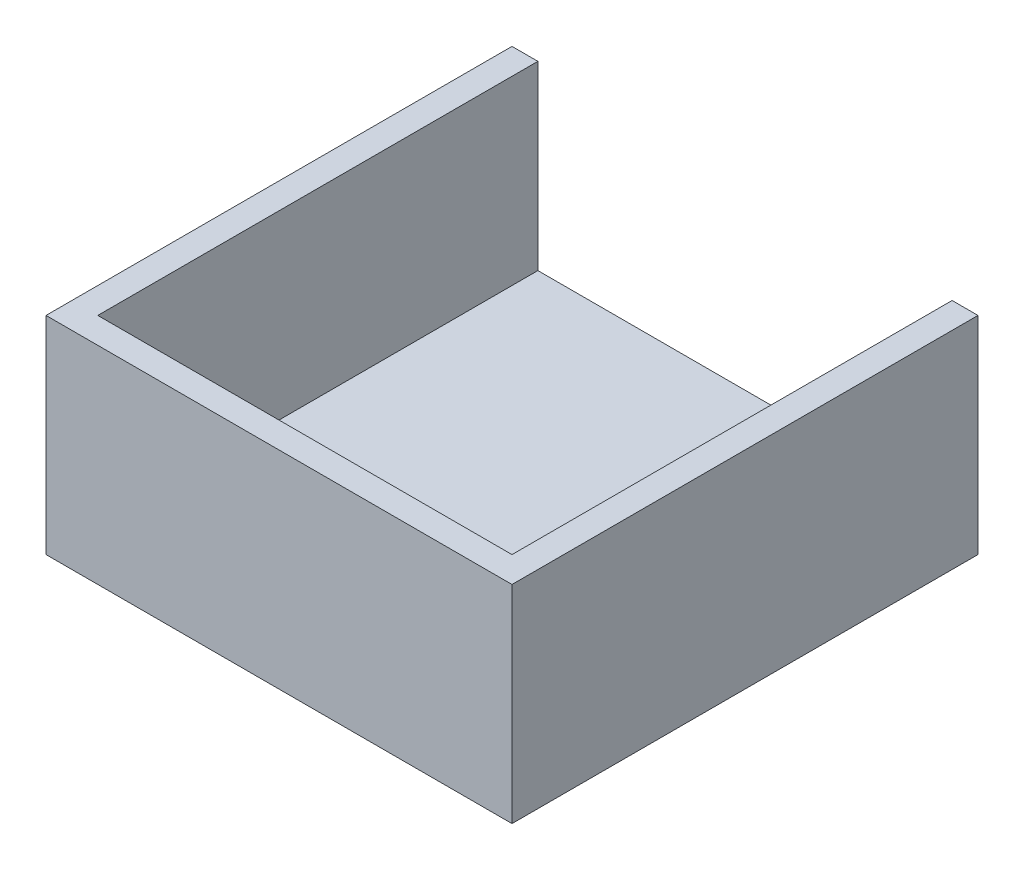
ISO-10303-21;
HEADER;
FILE_DESCRIPTION(('STEP AP214'),'2;1');
FILE_NAME('part.step','',(''),(''),'','','');
FILE_SCHEMA(('AUTOMOTIVE_DESIGN { 1 0 10303 214 1 1 1 1 }'));
ENDSEC;
DATA;
#1=APPLICATION_CONTEXT('core data for automotive mechanical design processes');
#2=APPLICATION_PROTOCOL_DEFINITION('international standard','automotive_design',2000,#1);
#3=PRODUCT_CONTEXT('',#1,'mechanical');
#4=PRODUCT('Part','Part','',(#3));
#5=PRODUCT_RELATED_PRODUCT_CATEGORY('part','',(#4));
#6=PRODUCT_DEFINITION_FORMATION('','',#4);
#7=PRODUCT_DEFINITION_CONTEXT('part definition',#1,'design');
#8=PRODUCT_DEFINITION('design','',#6,#7);
#9=PRODUCT_DEFINITION_SHAPE('','',#8);
#10=(LENGTH_UNIT() NAMED_UNIT(*) SI_UNIT(.MILLI.,.METRE.));
#11=(NAMED_UNIT(*) PLANE_ANGLE_UNIT() SI_UNIT($,.RADIAN.));
#12=(NAMED_UNIT(*) SI_UNIT($,.STERADIAN.) SOLID_ANGLE_UNIT());
#13=UNCERTAINTY_MEASURE_WITH_UNIT(LENGTH_MEASURE(1.E-05),#10,'distance_accuracy_value','');
#14=(GEOMETRIC_REPRESENTATION_CONTEXT(3) GLOBAL_UNCERTAINTY_ASSIGNED_CONTEXT((#13)) GLOBAL_UNIT_ASSIGNED_CONTEXT((#10,
#11,#12)) REPRESENTATION_CONTEXT('',''));
#15=CARTESIAN_POINT('',(0.,0.,0.));
#16=DIRECTION('',(0.,0.,1.));
#17=DIRECTION('',(1.,0.,0.));
#18=AXIS2_PLACEMENT_3D('',#15,#16,#17);
#19=CARTESIAN_POINT('',(9.,8.,-9.));
#20=DIRECTION('',(0.,0.,1.));
#21=DIRECTION('',(1.,0.,0.));
#22=AXIS2_PLACEMENT_3D('',#19,#20,#21);
#23=PLANE('',#22);
#24=DIRECTION('',(0.,1.,0.));
#25=VECTOR('',#24,1.);
#26=CARTESIAN_POINT('',(8.,1.,-9.));
#27=LINE('',#26,#25);
#28=CARTESIAN_POINT('',(8.,1.,-9.));
#29=VERTEX_POINT('',#28);
#30=CARTESIAN_POINT('',(8.,8.,-9.));
#31=VERTEX_POINT('',#30);
#32=EDGE_CURVE('E125',#29,#31,#27,.T.);
#33=ORIENTED_EDGE('',*,*,#32,.T.);
#34=DIRECTION('',(-1.,0.,0.));
#35=VECTOR('',#34,1.);
#36=CARTESIAN_POINT('',(9.,8.,-9.));
#37=LINE('',#36,#35);
#38=CARTESIAN_POINT('',(9.,8.,-9.));
#39=VERTEX_POINT('',#38);
#40=EDGE_CURVE('E145',#39,#31,#37,.T.);
#41=ORIENTED_EDGE('',*,*,#40,.F.);
#42=DIRECTION('',(0.,-1.,0.));
#43=VECTOR('',#42,1.);
#44=CARTESIAN_POINT('',(9.,8.,-9.));
#45=LINE('',#44,#43);
#46=CARTESIAN_POINT('',(9.,0.,-9.));
#47=VERTEX_POINT('',#46);
#48=EDGE_CURVE('E154',#39,#47,#45,.T.);
#49=ORIENTED_EDGE('',*,*,#48,.T.);
#50=DIRECTION('',(-1.,0.,0.));
#51=VECTOR('',#50,1.);
#52=CARTESIAN_POINT('',(9.,0.,-9.));
#53=LINE('',#52,#51);
#54=CARTESIAN_POINT('',(-9.,0.,-9.));
#55=VERTEX_POINT('',#54);
#56=EDGE_CURVE('E78',#47,#55,#53,.T.);
#57=ORIENTED_EDGE('',*,*,#56,.T.);
#58=DIRECTION('',(0.,-1.,0.));
#59=VECTOR('',#58,1.);
#60=CARTESIAN_POINT('',(-9.,8.,-9.));
#61=LINE('',#60,#59);
#62=CARTESIAN_POINT('',(-9.,8.,-9.));
#63=VERTEX_POINT('',#62);
#64=EDGE_CURVE('E147',#63,#55,#61,.T.);
#65=ORIENTED_EDGE('',*,*,#64,.F.);
#66=CARTESIAN_POINT('',(-8.,8.,-9.));
#67=VERTEX_POINT('',#66);
#68=EDGE_CURVE('E56',#67,#63,#37,.T.);
#69=ORIENTED_EDGE('',*,*,#68,.F.);
#70=DIRECTION('',(0.,1.,0.));
#71=VECTOR('',#70,1.);
#72=CARTESIAN_POINT('',(-8.,1.,-9.));
#73=LINE('',#72,#71);
#74=CARTESIAN_POINT('',(-8.,1.,-9.));
#75=VERTEX_POINT('',#74);
#76=EDGE_CURVE('E48',#75,#67,#73,.T.);
#77=ORIENTED_EDGE('',*,*,#76,.F.);
#78=DIRECTION('',(1.,0.,0.));
#79=VECTOR('',#78,1.);
#80=CARTESIAN_POINT('',(0.,1.,-9.));
#81=LINE('',#80,#79);
#82=EDGE_CURVE('E167',#75,#29,#81,.T.);
#83=ORIENTED_EDGE('',*,*,#82,.T.);
#84=EDGE_LOOP('',(#33,#41,#49,#57,#65,#69,#77,#83));
#85=FACE_BOUND('',#84,.T.);
#86=ADVANCED_FACE('F33',(#85),#23,.F.);
#87=CARTESIAN_POINT('',(0.,8.,0.));
#88=DIRECTION('',(0.,1.,0.));
#89=DIRECTION('',(0.,0.,1.));
#90=AXIS2_PLACEMENT_3D('',#87,#88,#89);
#91=PLANE('',#90);
#92=ORIENTED_EDGE('',*,*,#40,.T.);
#93=DIRECTION('',(0.,0.,1.));
#94=VECTOR('',#93,1.);
#95=CARTESIAN_POINT('',(8.,8.,0.));
#96=LINE('',#95,#94);
#97=CARTESIAN_POINT('',(8.,8.,8.));
#98=VERTEX_POINT('',#97);
#99=EDGE_CURVE('E172',#31,#98,#96,.T.);
#100=ORIENTED_EDGE('',*,*,#99,.T.);
#101=DIRECTION('',(-1.,0.,0.));
#102=VECTOR('',#101,1.);
#103=CARTESIAN_POINT('',(0.,8.,8.));
#104=LINE('',#103,#102);
#105=CARTESIAN_POINT('',(-8.,8.,8.));
#106=VERTEX_POINT('',#105);
#107=EDGE_CURVE('E130',#98,#106,#104,.T.);
#108=ORIENTED_EDGE('',*,*,#107,.T.);
#109=DIRECTION('',(0.,0.,-1.));
#110=VECTOR('',#109,1.);
#111=CARTESIAN_POINT('',(-8.,8.,0.));
#112=LINE('',#111,#110);
#113=EDGE_CURVE('E126',#106,#67,#112,.T.);
#114=ORIENTED_EDGE('',*,*,#113,.T.);
#115=ORIENTED_EDGE('',*,*,#68,.T.);
#116=DIRECTION('',(0.,0.,1.));
#117=VECTOR('',#116,1.);
#118=CARTESIAN_POINT('',(-9.,8.,9.));
#119=LINE('',#118,#117);
#120=CARTESIAN_POINT('',(-9.,8.,9.));
#121=VERTEX_POINT('',#120);
#122=EDGE_CURVE('E140',#63,#121,#119,.T.);
#123=ORIENTED_EDGE('',*,*,#122,.T.);
#124=DIRECTION('',(1.,0.,0.));
#125=VECTOR('',#124,1.);
#126=CARTESIAN_POINT('',(9.,8.,9.));
#127=LINE('',#126,#125);
#128=CARTESIAN_POINT('',(9.,8.,9.));
#129=VERTEX_POINT('',#128);
#130=EDGE_CURVE('E85',#121,#129,#127,.T.);
#131=ORIENTED_EDGE('',*,*,#130,.T.);
#132=DIRECTION('',(0.,0.,-1.));
#133=VECTOR('',#132,1.);
#134=CARTESIAN_POINT('',(9.,8.,9.));
#135=LINE('',#134,#133);
#136=EDGE_CURVE('E143',#129,#39,#135,.T.);
#137=ORIENTED_EDGE('',*,*,#136,.T.);
#138=EDGE_LOOP('',(#92,#100,#108,#114,#115,#123,#131,#137));
#139=FACE_BOUND('',#138,.T.);
#140=ADVANCED_FACE('F176',(#139),#91,.T.);
#141=CARTESIAN_POINT('',(-9.,8.,9.));
#142=DIRECTION('',(1.,0.,0.));
#143=DIRECTION('',(0.,0.,-1.));
#144=AXIS2_PLACEMENT_3D('',#141,#142,#143);
#145=PLANE('',#144);
#146=DIRECTION('',(0.,0.,1.));
#147=VECTOR('',#146,1.);
#148=CARTESIAN_POINT('',(-9.,0.,9.));
#149=LINE('',#148,#147);
#150=CARTESIAN_POINT('',(-9.,0.,9.));
#151=VERTEX_POINT('',#150);
#152=EDGE_CURVE('E131',#55,#151,#149,.T.);
#153=ORIENTED_EDGE('',*,*,#152,.T.);
#154=DIRECTION('',(0.,-1.,0.));
#155=VECTOR('',#154,1.);
#156=CARTESIAN_POINT('',(-9.,8.,9.));
#157=LINE('',#156,#155);
#158=EDGE_CURVE('E11',#121,#151,#157,.T.);
#159=ORIENTED_EDGE('',*,*,#158,.F.);
#160=ORIENTED_EDGE('',*,*,#122,.F.);
#161=ORIENTED_EDGE('',*,*,#64,.T.);
#162=EDGE_LOOP('',(#153,#159,#160,#161));
#163=FACE_BOUND('',#162,.T.);
#164=ADVANCED_FACE('F35',(#163),#145,.F.);
#165=CARTESIAN_POINT('',(9.,8.,9.));
#166=DIRECTION('',(0.,0.,-1.));
#167=DIRECTION('',(-1.,0.,0.));
#168=AXIS2_PLACEMENT_3D('',#165,#166,#167);
#169=PLANE('',#168);
#170=DIRECTION('',(1.,0.,0.));
#171=VECTOR('',#170,1.);
#172=CARTESIAN_POINT('',(9.,0.,9.));
#173=LINE('',#172,#171);
#174=CARTESIAN_POINT('',(9.,0.,9.));
#175=VERTEX_POINT('',#174);
#176=EDGE_CURVE('E135',#151,#175,#173,.T.);
#177=ORIENTED_EDGE('',*,*,#176,.T.);
#178=DIRECTION('',(0.,-1.,0.));
#179=VECTOR('',#178,1.);
#180=CARTESIAN_POINT('',(9.,8.,9.));
#181=LINE('',#180,#179);
#182=EDGE_CURVE('E41',#129,#175,#181,.T.);
#183=ORIENTED_EDGE('',*,*,#182,.F.);
#184=ORIENTED_EDGE('',*,*,#130,.F.);
#185=ORIENTED_EDGE('',*,*,#158,.T.);
#186=EDGE_LOOP('',(#177,#183,#184,#185));
#187=FACE_BOUND('',#186,.T.);
#188=ADVANCED_FACE('F184',(#187),#169,.F.);
#189=CARTESIAN_POINT('',(9.,8.,9.));
#190=DIRECTION('',(-1.,0.,0.));
#191=DIRECTION('',(0.,0.,1.));
#192=AXIS2_PLACEMENT_3D('',#189,#190,#191);
#193=PLANE('',#192);
#194=DIRECTION('',(0.,0.,-1.));
#195=VECTOR('',#194,1.);
#196=CARTESIAN_POINT('',(9.,0.,9.));
#197=LINE('',#196,#195);
#198=EDGE_CURVE('E150',#175,#47,#197,.T.);
#199=ORIENTED_EDGE('',*,*,#198,.T.);
#200=ORIENTED_EDGE('',*,*,#48,.F.);
#201=ORIENTED_EDGE('',*,*,#136,.F.);
#202=ORIENTED_EDGE('',*,*,#182,.T.);
#203=EDGE_LOOP('',(#199,#200,#201,#202));
#204=FACE_BOUND('',#203,.T.);
#205=ADVANCED_FACE('F159',(#204),#193,.F.);
#206=CARTESIAN_POINT('',(0.,0.,0.));
#207=DIRECTION('',(0.,1.,0.));
#208=DIRECTION('',(0.,0.,1.));
#209=AXIS2_PLACEMENT_3D('',#206,#207,#208);
#210=PLANE('',#209);
#211=ORIENTED_EDGE('',*,*,#152,.F.);
#212=ORIENTED_EDGE('',*,*,#56,.F.);
#213=ORIENTED_EDGE('',*,*,#198,.F.);
#214=ORIENTED_EDGE('',*,*,#176,.F.);
#215=EDGE_LOOP('',(#211,#212,#213,#214));
#216=FACE_BOUND('',#215,.T.);
#217=ADVANCED_FACE('F163',(#216),#210,.F.);
#218=CARTESIAN_POINT('',(8.,1.,0.));
#219=DIRECTION('',(-1.,0.,0.));
#220=DIRECTION('',(0.,0.,1.));
#221=AXIS2_PLACEMENT_3D('',#218,#219,#220);
#222=PLANE('',#221);
#223=ORIENTED_EDGE('',*,*,#99,.F.);
#224=ORIENTED_EDGE('',*,*,#32,.F.);
#225=DIRECTION('',(0.,0.,1.));
#226=VECTOR('',#225,1.);
#227=CARTESIAN_POINT('',(8.,1.,0.));
#228=LINE('',#227,#226);
#229=CARTESIAN_POINT('',(8.,1.,8.));
#230=VERTEX_POINT('',#229);
#231=EDGE_CURVE('E112',#29,#230,#228,.T.);
#232=ORIENTED_EDGE('',*,*,#231,.T.);
#233=DIRECTION('',(0.,1.,0.));
#234=VECTOR('',#233,1.);
#235=CARTESIAN_POINT('',(8.,1.,8.));
#236=LINE('',#235,#234);
#237=EDGE_CURVE('E122',#230,#98,#236,.T.);
#238=ORIENTED_EDGE('',*,*,#237,.T.);
#239=EDGE_LOOP('',(#223,#224,#232,#238));
#240=FACE_BOUND('',#239,.T.);
#241=ADVANCED_FACE('F121',(#240),#222,.T.);
#242=CARTESIAN_POINT('',(0.,1.,8.));
#243=DIRECTION('',(0.,0.,-1.));
#244=DIRECTION('',(-1.,0.,0.));
#245=AXIS2_PLACEMENT_3D('',#242,#243,#244);
#246=PLANE('',#245);
#247=ORIENTED_EDGE('',*,*,#107,.F.);
#248=ORIENTED_EDGE('',*,*,#237,.F.);
#249=DIRECTION('',(-1.,0.,0.));
#250=VECTOR('',#249,1.);
#251=CARTESIAN_POINT('',(0.,1.,8.));
#252=LINE('',#251,#250);
#253=CARTESIAN_POINT('',(-8.,1.,8.));
#254=VERTEX_POINT('',#253);
#255=EDGE_CURVE('E108',#230,#254,#252,.T.);
#256=ORIENTED_EDGE('',*,*,#255,.T.);
#257=DIRECTION('',(0.,1.,0.));
#258=VECTOR('',#257,1.);
#259=CARTESIAN_POINT('',(-8.,1.,8.));
#260=LINE('',#259,#258);
#261=EDGE_CURVE('E132',#254,#106,#260,.T.);
#262=ORIENTED_EDGE('',*,*,#261,.T.);
#263=EDGE_LOOP('',(#247,#248,#256,#262));
#264=FACE_BOUND('',#263,.T.);
#265=ADVANCED_FACE('F128',(#264),#246,.T.);
#266=CARTESIAN_POINT('',(-8.,1.,0.));
#267=DIRECTION('',(1.,0.,0.));
#268=DIRECTION('',(0.,0.,-1.));
#269=AXIS2_PLACEMENT_3D('',#266,#267,#268);
#270=PLANE('',#269);
#271=ORIENTED_EDGE('',*,*,#113,.F.);
#272=ORIENTED_EDGE('',*,*,#261,.F.);
#273=DIRECTION('',(0.,0.,-1.));
#274=VECTOR('',#273,1.);
#275=CARTESIAN_POINT('',(-8.,1.,0.));
#276=LINE('',#275,#274);
#277=EDGE_CURVE('E114',#254,#75,#276,.T.);
#278=ORIENTED_EDGE('',*,*,#277,.T.);
#279=ORIENTED_EDGE('',*,*,#76,.T.);
#280=EDGE_LOOP('',(#271,#272,#278,#279));
#281=FACE_BOUND('',#280,.T.);
#282=ADVANCED_FACE('F175',(#281),#270,.T.);
#283=CARTESIAN_POINT('',(0.,1.,0.));
#284=DIRECTION('',(0.,-1.,0.));
#285=DIRECTION('',(0.,0.,-1.));
#286=AXIS2_PLACEMENT_3D('',#283,#284,#285);
#287=PLANE('',#286);
#288=ORIENTED_EDGE('',*,*,#231,.F.);
#289=ORIENTED_EDGE('',*,*,#82,.F.);
#290=ORIENTED_EDGE('',*,*,#277,.F.);
#291=ORIENTED_EDGE('',*,*,#255,.F.);
#292=EDGE_LOOP('',(#288,#289,#290,#291));
#293=FACE_BOUND('',#292,.T.);
#294=ADVANCED_FACE('F110',(#293),#287,.F.);
#295=CLOSED_SHELL('',(#86,#140,#164,#188,#205,#217,#241,#265,#282,#294));
#296=MANIFOLD_SOLID_BREP('B2',#295);
#297=ADVANCED_BREP_SHAPE_REPRESENTATION('',(#18,#296),#14);
#298=SHAPE_DEFINITION_REPRESENTATION(#9,#297);
ENDSEC;
END-ISO-10303-21;
